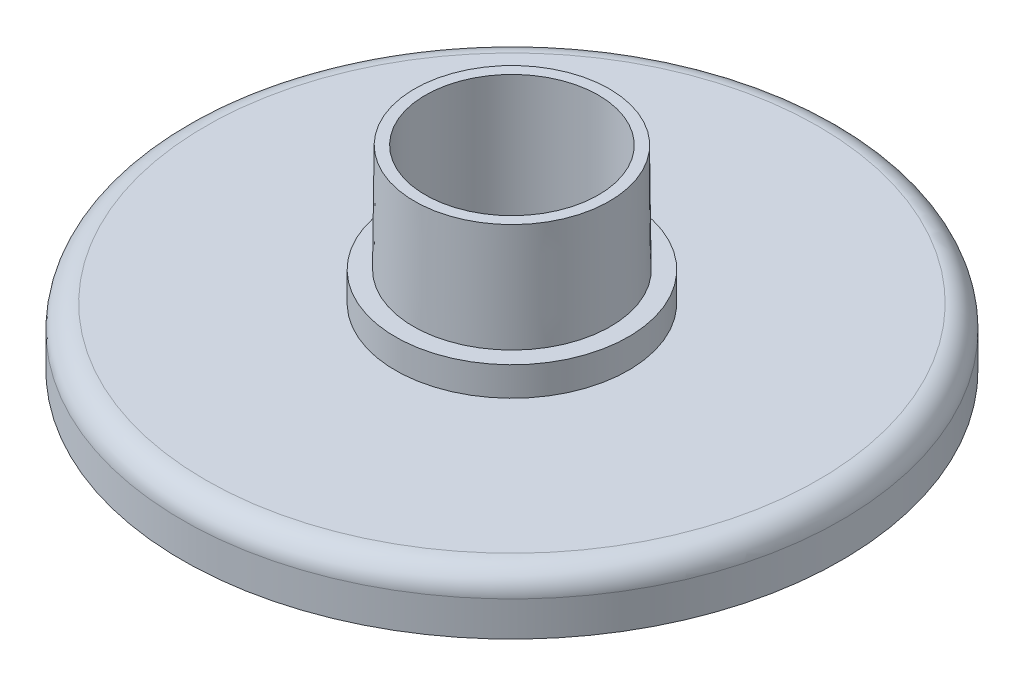
ISO-10303-21;
HEADER;
FILE_DESCRIPTION(('STEP AP214'),'2;1');
FILE_NAME('part.step','',(''),(''),'','','');
FILE_SCHEMA(('AUTOMOTIVE_DESIGN { 1 0 10303 214 1 1 1 1 }'));
ENDSEC;
DATA;
#1=APPLICATION_CONTEXT('core data for automotive mechanical design processes');
#2=APPLICATION_PROTOCOL_DEFINITION('international standard','automotive_design',2000,#1);
#3=PRODUCT_CONTEXT('',#1,'mechanical');
#4=PRODUCT('Part','Part','',(#3));
#5=PRODUCT_RELATED_PRODUCT_CATEGORY('part','',(#4));
#6=PRODUCT_DEFINITION_FORMATION('','',#4);
#7=PRODUCT_DEFINITION_CONTEXT('part definition',#1,'design');
#8=PRODUCT_DEFINITION('design','',#6,#7);
#9=PRODUCT_DEFINITION_SHAPE('','',#8);
#10=(LENGTH_UNIT() NAMED_UNIT(*) SI_UNIT(.MILLI.,.METRE.));
#11=(NAMED_UNIT(*) PLANE_ANGLE_UNIT() SI_UNIT($,.RADIAN.));
#12=(NAMED_UNIT(*) SI_UNIT($,.STERADIAN.) SOLID_ANGLE_UNIT());
#13=UNCERTAINTY_MEASURE_WITH_UNIT(LENGTH_MEASURE(1.E-05),#10,'distance_accuracy_value','');
#14=(GEOMETRIC_REPRESENTATION_CONTEXT(3) GLOBAL_UNCERTAINTY_ASSIGNED_CONTEXT((#13)) GLOBAL_UNIT_ASSIGNED_CONTEXT((#10,
#11,#12)) REPRESENTATION_CONTEXT('',''));
#15=CARTESIAN_POINT('',(0.,0.,0.));
#16=DIRECTION('',(0.,0.,1.));
#17=DIRECTION('',(1.,0.,0.));
#18=AXIS2_PLACEMENT_3D('',#15,#16,#17);
#19=CARTESIAN_POINT('',(0.,0.,0.));
#20=DIRECTION('',(0.,-1.,0.));
#21=DIRECTION('',(0.,0.,-1.));
#22=AXIS2_PLACEMENT_3D('',#19,#20,#21);
#23=CYLINDRICAL_SURFACE('',#22,28.415);
#24=CARTESIAN_POINT('',(0.,0.,0.));
#25=DIRECTION('',(0.,-1.,0.));
#26=DIRECTION('',(0.,0.,-1.));
#27=AXIS2_PLACEMENT_3D('',#24,#25,#26);
#28=CIRCLE('',#27,28.415);
#29=CARTESIAN_POINT('',(0.,0.,-28.415));
#30=VERTEX_POINT('',#29);
#31=EDGE_CURVE('E61',#30,#30,#28,.T.);
#32=ORIENTED_EDGE('',*,*,#31,.F.);
#33=EDGE_LOOP('',(#32));
#34=FACE_BOUND('',#33,.T.);
#35=CARTESIAN_POINT('',(0.,3.,0.));
#36=DIRECTION('',(0.,-1.,0.));
#37=DIRECTION('',(0.,0.,-1.));
#38=AXIS2_PLACEMENT_3D('',#35,#36,#37);
#39=CIRCLE('',#38,28.415);
#40=CARTESIAN_POINT('',(0.,3.,-28.415));
#41=VERTEX_POINT('',#40);
#42=EDGE_CURVE('E10',#41,#41,#39,.T.);
#43=ORIENTED_EDGE('',*,*,#42,.T.);
#44=EDGE_LOOP('',(#43));
#45=FACE_BOUND('',#44,.T.);
#46=ADVANCED_FACE('F30',(#34,#45),#23,.T.);
#47=CARTESIAN_POINT('',(0.,3.,0.));
#48=DIRECTION('',(0.,-1.,0.));
#49=DIRECTION('',(0.,0.,-1.));
#50=AXIS2_PLACEMENT_3D('',#47,#48,#49);
#51=TOROIDAL_SURFACE('',#50,26.415,2.);
#52=ORIENTED_EDGE('',*,*,#42,.F.);
#53=EDGE_LOOP('',(#52));
#54=FACE_BOUND('',#53,.T.);
#55=CARTESIAN_POINT('',(0.,5.,0.));
#56=DIRECTION('',(0.,-1.,0.));
#57=DIRECTION('',(0.,0.,-1.));
#58=AXIS2_PLACEMENT_3D('',#55,#56,#57);
#59=CIRCLE('',#58,26.415);
#60=CARTESIAN_POINT('',(0.,5.,-26.415));
#61=VERTEX_POINT('',#60);
#62=EDGE_CURVE('E36',#61,#61,#59,.T.);
#63=ORIENTED_EDGE('',*,*,#62,.T.);
#64=EDGE_LOOP('',(#63));
#65=FACE_BOUND('',#64,.T.);
#66=ADVANCED_FACE('F68',(#54,#65),#51,.T.);
#67=CARTESIAN_POINT('',(0.,5.,26.415));
#68=DIRECTION('',(0.,-1.,0.));
#69=DIRECTION('',(0.,0.,-1.));
#70=AXIS2_PLACEMENT_3D('',#67,#68,#69);
#71=PLANE('',#70);
#72=ORIENTED_EDGE('',*,*,#62,.F.);
#73=EDGE_LOOP('',(#72));
#74=FACE_BOUND('',#73,.T.);
#75=CARTESIAN_POINT('',(0.,5.,0.));
#76=DIRECTION('',(0.,-1.,0.));
#77=DIRECTION('',(0.,0.,-1.));
#78=AXIS2_PLACEMENT_3D('',#75,#76,#77);
#79=CIRCLE('',#78,10.05);
#80=CARTESIAN_POINT('',(0.,5.,-10.05));
#81=VERTEX_POINT('',#80);
#82=EDGE_CURVE('E40',#81,#81,#79,.T.);
#83=ORIENTED_EDGE('',*,*,#82,.T.);
#84=EDGE_LOOP('',(#83));
#85=FACE_BOUND('',#84,.T.);
#86=ADVANCED_FACE('F72',(#74,#85),#71,.F.);
#87=CARTESIAN_POINT('',(0.,0.,0.));
#88=DIRECTION('',(0.,-1.,0.));
#89=DIRECTION('',(0.,0.,-1.));
#90=AXIS2_PLACEMENT_3D('',#87,#88,#89);
#91=CYLINDRICAL_SURFACE('',#90,10.05);
#92=ORIENTED_EDGE('',*,*,#82,.F.);
#93=EDGE_LOOP('',(#92));
#94=FACE_BOUND('',#93,.T.);
#95=CARTESIAN_POINT('',(0.,7.5,0.));
#96=DIRECTION('',(0.,-1.,0.));
#97=DIRECTION('',(0.,0.,-1.));
#98=AXIS2_PLACEMENT_3D('',#95,#96,#97);
#99=CIRCLE('',#98,10.05);
#100=CARTESIAN_POINT('',(0.,7.5,-10.05));
#101=VERTEX_POINT('',#100);
#102=EDGE_CURVE('E44',#101,#101,#99,.T.);
#103=ORIENTED_EDGE('',*,*,#102,.T.);
#104=EDGE_LOOP('',(#103));
#105=FACE_BOUND('',#104,.T.);
#106=ADVANCED_FACE('F77',(#94,#105),#91,.T.);
#107=CARTESIAN_POINT('',(0.,7.5,10.05));
#108=DIRECTION('',(0.,-1.,0.));
#109=DIRECTION('',(0.,0.,-1.));
#110=AXIS2_PLACEMENT_3D('',#107,#108,#109);
#111=PLANE('',#110);
#112=ORIENTED_EDGE('',*,*,#102,.F.);
#113=EDGE_LOOP('',(#112));
#114=FACE_BOUND('',#113,.T.);
#115=CARTESIAN_POINT('',(0.,7.5,0.));
#116=DIRECTION('',(0.,-1.,0.));
#117=DIRECTION('',(0.,0.,-1.));
#118=AXIS2_PLACEMENT_3D('',#115,#116,#117);
#119=CIRCLE('',#118,8.5);
#120=CARTESIAN_POINT('',(0.,7.5,-8.5));
#121=VERTEX_POINT('',#120);
#122=EDGE_CURVE('E49',#121,#121,#119,.T.);
#123=ORIENTED_EDGE('',*,*,#122,.T.);
#124=EDGE_LOOP('',(#123));
#125=FACE_BOUND('',#124,.T.);
#126=ADVANCED_FACE('F83',(#114,#125),#111,.F.);
#127=CARTESIAN_POINT('',(0.,16.8,0.));
#128=DIRECTION('',(0.,-1.,0.));
#129=DIRECTION('',(0.,0.,-1.));
#130=AXIS2_PLACEMENT_3D('',#127,#128,#129);
#131=CONICAL_SURFACE('',#130,8.4,0.0107522737911012);
#132=ORIENTED_EDGE('',*,*,#122,.F.);
#133=EDGE_LOOP('',(#132));
#134=FACE_BOUND('',#133,.T.);
#135=CARTESIAN_POINT('',(0.,16.8,0.));
#136=DIRECTION('',(0.,-1.,0.));
#137=DIRECTION('',(0.,0.,-1.));
#138=AXIS2_PLACEMENT_3D('',#135,#136,#137);
#139=CIRCLE('',#138,8.4);
#140=CARTESIAN_POINT('',(0.,16.8,-8.4));
#141=VERTEX_POINT('',#140);
#142=EDGE_CURVE('E52',#141,#141,#139,.T.);
#143=ORIENTED_EDGE('',*,*,#142,.T.);
#144=EDGE_LOOP('',(#143));
#145=FACE_BOUND('',#144,.T.);
#146=ADVANCED_FACE('F87',(#134,#145),#131,.T.);
#147=CARTESIAN_POINT('',(0.,16.8,8.4));
#148=DIRECTION('',(0.,-1.,0.));
#149=DIRECTION('',(0.,0.,-1.));
#150=AXIS2_PLACEMENT_3D('',#147,#148,#149);
#151=PLANE('',#150);
#152=ORIENTED_EDGE('',*,*,#142,.F.);
#153=EDGE_LOOP('',(#152));
#154=FACE_BOUND('',#153,.T.);
#155=CARTESIAN_POINT('',(0.,16.8,0.));
#156=DIRECTION('',(0.,-1.,0.));
#157=DIRECTION('',(0.,0.,-1.));
#158=AXIS2_PLACEMENT_3D('',#155,#156,#157);
#159=CIRCLE('',#158,7.46);
#160=CARTESIAN_POINT('',(0.,16.8,-7.46));
#161=VERTEX_POINT('',#160);
#162=EDGE_CURVE('E55',#161,#161,#159,.T.);
#163=ORIENTED_EDGE('',*,*,#162,.T.);
#164=EDGE_LOOP('',(#163));
#165=FACE_BOUND('',#164,.T.);
#166=ADVANCED_FACE('F91',(#154,#165),#151,.F.);
#167=CARTESIAN_POINT('',(0.,0.,0.));
#168=DIRECTION('',(0.,-1.,0.));
#169=DIRECTION('',(0.,0.,-1.));
#170=AXIS2_PLACEMENT_3D('',#167,#168,#169);
#171=CYLINDRICAL_SURFACE('',#170,7.46);
#172=ORIENTED_EDGE('',*,*,#162,.F.);
#173=EDGE_LOOP('',(#172));
#174=FACE_BOUND('',#173,.T.);
#175=CARTESIAN_POINT('',(0.,0.,0.));
#176=DIRECTION('',(0.,-1.,0.));
#177=DIRECTION('',(0.,0.,-1.));
#178=AXIS2_PLACEMENT_3D('',#175,#176,#177);
#179=CIRCLE('',#178,7.46);
#180=CARTESIAN_POINT('',(0.,0.,-7.46));
#181=VERTEX_POINT('',#180);
#182=EDGE_CURVE('E58',#181,#181,#179,.T.);
#183=ORIENTED_EDGE('',*,*,#182,.T.);
#184=EDGE_LOOP('',(#183));
#185=FACE_BOUND('',#184,.T.);
#186=ADVANCED_FACE('F95',(#174,#185),#171,.F.);
#187=CARTESIAN_POINT('',(0.,0.,7.46));
#188=DIRECTION('',(0.,1.,0.));
#189=DIRECTION('',(0.,0.,1.));
#190=AXIS2_PLACEMENT_3D('',#187,#188,#189);
#191=PLANE('',#190);
#192=ORIENTED_EDGE('',*,*,#182,.F.);
#193=EDGE_LOOP('',(#192));
#194=FACE_BOUND('',#193,.T.);
#195=ORIENTED_EDGE('',*,*,#31,.T.);
#196=EDGE_LOOP('',(#195));
#197=FACE_BOUND('',#196,.T.);
#198=ADVANCED_FACE('F65',(#194,#197),#191,.F.);
#199=CLOSED_SHELL('',(#46,#66,#86,#106,#126,#146,#166,#186,#198));
#200=MANIFOLD_SOLID_BREP('B2',#199);
#201=ADVANCED_BREP_SHAPE_REPRESENTATION('',(#18,#200),#14);
#202=SHAPE_DEFINITION_REPRESENTATION(#9,#201);
ENDSEC;
END-ISO-10303-21;
